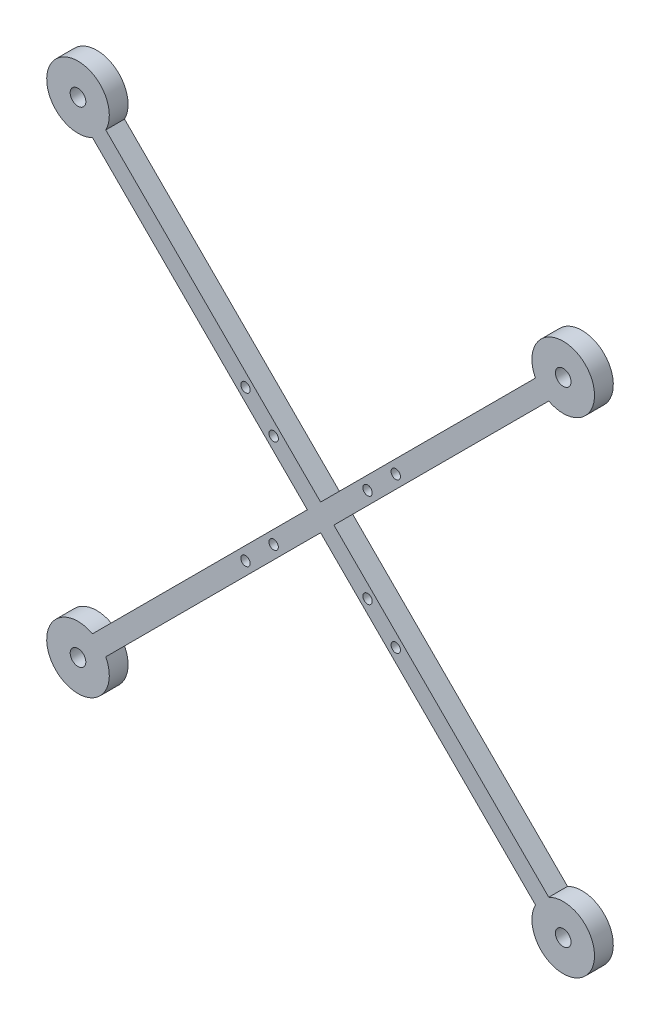
ISO-10303-21;
HEADER;
FILE_DESCRIPTION(('STEP AP214'),'2;1');
FILE_NAME('part.step','',(''),(''),'','','');
FILE_SCHEMA(('AUTOMOTIVE_DESIGN { 1 0 10303 214 1 1 1 1 }'));
ENDSEC;
DATA;
#1=APPLICATION_CONTEXT('core data for automotive mechanical design processes');
#2=APPLICATION_PROTOCOL_DEFINITION('international standard','automotive_design',2000,#1);
#3=PRODUCT_CONTEXT('',#1,'mechanical');
#4=PRODUCT('Part','Part','',(#3));
#5=PRODUCT_RELATED_PRODUCT_CATEGORY('part','',(#4));
#6=PRODUCT_DEFINITION_FORMATION('','',#4);
#7=PRODUCT_DEFINITION_CONTEXT('part definition',#1,'design');
#8=PRODUCT_DEFINITION('design','',#6,#7);
#9=PRODUCT_DEFINITION_SHAPE('','',#8);
#10=(LENGTH_UNIT() NAMED_UNIT(*) SI_UNIT(.MILLI.,.METRE.));
#11=(NAMED_UNIT(*) PLANE_ANGLE_UNIT() SI_UNIT($,.RADIAN.));
#12=(NAMED_UNIT(*) SI_UNIT($,.STERADIAN.) SOLID_ANGLE_UNIT());
#13=UNCERTAINTY_MEASURE_WITH_UNIT(LENGTH_MEASURE(1.E-05),#10,'distance_accuracy_value','');
#14=(GEOMETRIC_REPRESENTATION_CONTEXT(3) GLOBAL_UNCERTAINTY_ASSIGNED_CONTEXT((#13)) GLOBAL_UNIT_ASSIGNED_CONTEXT((#10,
#11,#12)) REPRESENTATION_CONTEXT('',''));
#15=CARTESIAN_POINT('',(0.,0.,0.));
#16=DIRECTION('',(0.,0.,1.));
#17=DIRECTION('',(1.,0.,0.));
#18=AXIS2_PLACEMENT_3D('',#15,#16,#17);
#19=CARTESIAN_POINT('',(-2.12132034355965,2.12132034355964,6.));
#20=DIRECTION('',(-0.707106781186548,0.707106781186547,0.));
#21=DIRECTION('',(-0.707106781186547,-0.707106781186548,0.));
#22=AXIS2_PLACEMENT_3D('',#19,#20,#21);
#23=PLANE('',#22);
#24=DIRECTION('',(0.707106781186547,0.707106781186548,0.));
#25=VECTOR('',#24,1.);
#26=CARTESIAN_POINT('',(-2.12132034355965,2.12132034355964,0.));
#27=LINE('',#26,#25);
#28=CARTESIAN_POINT('',(-72.8759515619436,-68.6333108748244,0.));
#29=VERTEX_POINT('',#28);
#30=CARTESIAN_POINT('',(-4.24264068711929,0.,0.));
#31=VERTEX_POINT('',#30);
#32=EDGE_CURVE('E199',#29,#31,#27,.T.);
#33=ORIENTED_EDGE('',*,*,#32,.F.);
#34=DIRECTION('',(0.,0.,-1.));
#35=VECTOR('',#34,1.);
#36=CARTESIAN_POINT('',(-72.8759515619436,-68.6333108748244,6.));
#37=LINE('',#36,#35);
#38=CARTESIAN_POINT('',(-72.8759515619436,-68.6333108748244,6.));
#39=VERTEX_POINT('',#38);
#40=EDGE_CURVE('E11',#39,#29,#37,.T.);
#41=ORIENTED_EDGE('',*,*,#40,.F.);
#42=DIRECTION('',(0.707106781186547,0.707106781186548,0.));
#43=VECTOR('',#42,1.);
#44=CARTESIAN_POINT('',(-2.12132034355965,2.12132034355964,6.));
#45=LINE('',#44,#43);
#46=CARTESIAN_POINT('',(-4.24264068711929,0.,6.));
#47=VERTEX_POINT('',#46);
#48=EDGE_CURVE('E590',#39,#47,#45,.T.);
#49=ORIENTED_EDGE('',*,*,#48,.T.);
#50=DIRECTION('',(0.,0.,-1.));
#51=VECTOR('',#50,1.);
#52=CARTESIAN_POINT('',(-4.24264068711929,0.,6.));
#53=LINE('',#52,#51);
#54=EDGE_CURVE('E105',#47,#31,#53,.T.);
#55=ORIENTED_EDGE('',*,*,#54,.T.);
#56=EDGE_LOOP('',(#33,#41,#49,#55));
#57=FACE_BOUND('',#56,.T.);
#58=ADVANCED_FACE('F41',(#57),#23,.T.);
#59=CARTESIAN_POINT('',(-77.5,-77.5,6.));
#60=DIRECTION('',(0.,0.,-1.));
#61=DIRECTION('',(-1.,0.,0.));
#62=AXIS2_PLACEMENT_3D('',#59,#60,#61);
#63=CYLINDRICAL_SURFACE('',#62,9.99999999999999);
#64=CARTESIAN_POINT('',(-77.5,-77.5,0.));
#65=DIRECTION('',(0.,0.,1.));
#66=DIRECTION('',(1.,0.,0.));
#67=AXIS2_PLACEMENT_3D('',#64,#65,#66);
#68=CIRCLE('',#67,9.99999999999999);
#69=CARTESIAN_POINT('',(-68.6333108748243,-72.8759515619436,0.));
#70=VERTEX_POINT('',#69);
#71=EDGE_CURVE('E201',#29,#70,#68,.T.);
#72=ORIENTED_EDGE('',*,*,#71,.T.);
#73=DIRECTION('',(0.,0.,-1.));
#74=VECTOR('',#73,1.);
#75=CARTESIAN_POINT('',(-68.6333108748243,-72.8759515619436,6.));
#76=LINE('',#75,#74);
#77=CARTESIAN_POINT('',(-68.6333108748243,-72.8759515619436,6.));
#78=VERTEX_POINT('',#77);
#79=EDGE_CURVE('E50',#78,#70,#76,.T.);
#80=ORIENTED_EDGE('',*,*,#79,.F.);
#81=CARTESIAN_POINT('',(-77.5,-77.5,6.));
#82=DIRECTION('',(0.,0.,1.));
#83=DIRECTION('',(1.,0.,0.));
#84=AXIS2_PLACEMENT_3D('',#81,#82,#83);
#85=CIRCLE('',#84,9.99999999999999);
#86=EDGE_CURVE('E576',#39,#78,#85,.T.);
#87=ORIENTED_EDGE('',*,*,#86,.F.);
#88=ORIENTED_EDGE('',*,*,#40,.T.);
#89=EDGE_LOOP('',(#72,#80,#87,#88));
#90=FACE_BOUND('',#89,.T.);
#91=ADVANCED_FACE('F255',(#90),#63,.T.);
#92=CARTESIAN_POINT('',(2.12132034355964,-2.12132034355964,6.));
#93=DIRECTION('',(-0.707106781186548,0.707106781186547,0.));
#94=DIRECTION('',(-0.707106781186547,-0.707106781186548,0.));
#95=AXIS2_PLACEMENT_3D('',#92,#93,#94);
#96=PLANE('',#95);
#97=DIRECTION('',(0.707106781186547,0.707106781186548,0.));
#98=VECTOR('',#97,1.);
#99=CARTESIAN_POINT('',(2.12132034355964,-2.12132034355964,0.));
#100=LINE('',#99,#98);
#101=CARTESIAN_POINT('',(0.,-4.24264068711927,0.));
#102=VERTEX_POINT('',#101);
#103=EDGE_CURVE('E204',#70,#102,#100,.T.);
#104=ORIENTED_EDGE('',*,*,#103,.T.);
#105=DIRECTION('',(0.,0.,-1.));
#106=VECTOR('',#105,1.);
#107=CARTESIAN_POINT('',(0.,-4.24264068711927,6.));
#108=LINE('',#107,#106);
#109=CARTESIAN_POINT('',(0.,-4.24264068711927,6.));
#110=VERTEX_POINT('',#109);
#111=EDGE_CURVE('E245',#110,#102,#108,.T.);
#112=ORIENTED_EDGE('',*,*,#111,.F.);
#113=DIRECTION('',(0.707106781186547,0.707106781186548,0.));
#114=VECTOR('',#113,1.);
#115=CARTESIAN_POINT('',(2.12132034355964,-2.12132034355964,6.));
#116=LINE('',#115,#114);
#117=EDGE_CURVE('E251',#78,#110,#116,.T.);
#118=ORIENTED_EDGE('',*,*,#117,.F.);
#119=ORIENTED_EDGE('',*,*,#79,.T.);
#120=EDGE_LOOP('',(#104,#112,#118,#119));
#121=FACE_BOUND('',#120,.T.);
#122=ADVANCED_FACE('F249',(#121),#96,.F.);
#123=CARTESIAN_POINT('',(-2.12132034355963,-2.12132034355963,6.));
#124=DIRECTION('',(-0.707106781186547,-0.707106781186547,0.));
#125=DIRECTION('',(0.707106781186548,-0.707106781186548,0.));
#126=AXIS2_PLACEMENT_3D('',#123,#124,#125);
#127=PLANE('',#126);
#128=DIRECTION('',(-0.707106781186548,0.707106781186548,0.));
#129=VECTOR('',#128,1.);
#130=CARTESIAN_POINT('',(-2.12132034355963,-2.12132034355963,0.));
#131=LINE('',#130,#129);
#132=CARTESIAN_POINT('',(68.6333108748243,-72.8759515619436,0.));
#133=VERTEX_POINT('',#132);
#134=EDGE_CURVE('E207',#133,#102,#131,.T.);
#135=ORIENTED_EDGE('',*,*,#134,.F.);
#136=DIRECTION('',(0.,0.,-1.));
#137=VECTOR('',#136,1.);
#138=CARTESIAN_POINT('',(68.6333108748243,-72.8759515619436,6.));
#139=LINE('',#138,#137);
#140=CARTESIAN_POINT('',(68.6333108748243,-72.8759515619436,6.));
#141=VERTEX_POINT('',#140);
#142=EDGE_CURVE('E243',#141,#133,#139,.T.);
#143=ORIENTED_EDGE('',*,*,#142,.F.);
#144=DIRECTION('',(-0.707106781186548,0.707106781186548,0.));
#145=VECTOR('',#144,1.);
#146=CARTESIAN_POINT('',(-2.12132034355963,-2.12132034355963,6.));
#147=LINE('',#146,#145);
#148=EDGE_CURVE('E573',#141,#110,#147,.T.);
#149=ORIENTED_EDGE('',*,*,#148,.T.);
#150=ORIENTED_EDGE('',*,*,#111,.T.);
#151=EDGE_LOOP('',(#135,#143,#149,#150));
#152=FACE_BOUND('',#151,.T.);
#153=ADVANCED_FACE('F383',(#152),#127,.T.);
#154=CARTESIAN_POINT('',(77.5,-77.5,6.));
#155=DIRECTION('',(0.,0.,-1.));
#156=DIRECTION('',(-1.,0.,0.));
#157=AXIS2_PLACEMENT_3D('',#154,#155,#156);
#158=CYLINDRICAL_SURFACE('',#157,9.99999999999999);
#159=CARTESIAN_POINT('',(77.5,-77.5,0.));
#160=DIRECTION('',(0.,0.,1.));
#161=DIRECTION('',(1.,0.,0.));
#162=AXIS2_PLACEMENT_3D('',#159,#160,#161);
#163=CIRCLE('',#162,9.99999999999999);
#164=CARTESIAN_POINT('',(72.8759515619437,-68.6333108748243,0.));
#165=VERTEX_POINT('',#164);
#166=EDGE_CURVE('E210',#133,#165,#163,.T.);
#167=ORIENTED_EDGE('',*,*,#166,.T.);
#168=DIRECTION('',(0.,0.,-1.));
#169=VECTOR('',#168,1.);
#170=CARTESIAN_POINT('',(72.8759515619437,-68.6333108748243,6.));
#171=LINE('',#170,#169);
#172=CARTESIAN_POINT('',(72.8759515619437,-68.6333108748243,6.));
#173=VERTEX_POINT('',#172);
#174=EDGE_CURVE('E240',#173,#165,#171,.T.);
#175=ORIENTED_EDGE('',*,*,#174,.F.);
#176=CARTESIAN_POINT('',(77.5,-77.5,6.));
#177=DIRECTION('',(0.,0.,1.));
#178=DIRECTION('',(1.,0.,0.));
#179=AXIS2_PLACEMENT_3D('',#176,#177,#178);
#180=CIRCLE('',#179,9.99999999999999);
#181=EDGE_CURVE('E570',#141,#173,#180,.T.);
#182=ORIENTED_EDGE('',*,*,#181,.F.);
#183=ORIENTED_EDGE('',*,*,#142,.T.);
#184=EDGE_LOOP('',(#167,#175,#182,#183));
#185=FACE_BOUND('',#184,.T.);
#186=ADVANCED_FACE('F379',(#185),#158,.T.);
#187=CARTESIAN_POINT('',(2.12132034355965,2.12132034355965,6.));
#188=DIRECTION('',(-0.707106781186547,-0.707106781186548,0.));
#189=DIRECTION('',(0.707106781186548,-0.707106781186547,0.));
#190=AXIS2_PLACEMENT_3D('',#187,#188,#189);
#191=PLANE('',#190);
#192=DIRECTION('',(-0.707106781186548,0.707106781186547,0.));
#193=VECTOR('',#192,1.);
#194=CARTESIAN_POINT('',(2.12132034355965,2.12132034355965,0.));
#195=LINE('',#194,#193);
#196=CARTESIAN_POINT('',(4.2426406871193,0.,0.));
#197=VERTEX_POINT('',#196);
#198=EDGE_CURVE('E213',#165,#197,#195,.T.);
#199=ORIENTED_EDGE('',*,*,#198,.T.);
#200=DIRECTION('',(0.,0.,-1.));
#201=VECTOR('',#200,1.);
#202=CARTESIAN_POINT('',(4.2426406871193,0.,6.));
#203=LINE('',#202,#201);
#204=CARTESIAN_POINT('',(4.2426406871193,0.,6.));
#205=VERTEX_POINT('',#204);
#206=EDGE_CURVE('E238',#205,#197,#203,.T.);
#207=ORIENTED_EDGE('',*,*,#206,.F.);
#208=DIRECTION('',(-0.707106781186548,0.707106781186547,0.));
#209=VECTOR('',#208,1.);
#210=CARTESIAN_POINT('',(2.12132034355965,2.12132034355965,6.));
#211=LINE('',#210,#209);
#212=EDGE_CURVE('E572',#173,#205,#211,.T.);
#213=ORIENTED_EDGE('',*,*,#212,.F.);
#214=ORIENTED_EDGE('',*,*,#174,.T.);
#215=EDGE_LOOP('',(#199,#207,#213,#214));
#216=FACE_BOUND('',#215,.T.);
#217=ADVANCED_FACE('F375',(#216),#191,.F.);
#218=CARTESIAN_POINT('',(2.12132034355964,-2.12132034355964,6.));
#219=DIRECTION('',(0.707106781186547,-0.707106781186548,0.));
#220=DIRECTION('',(0.707106781186548,0.707106781186547,0.));
#221=AXIS2_PLACEMENT_3D('',#218,#219,#220);
#222=PLANE('',#221);
#223=DIRECTION('',(-0.707106781186548,-0.707106781186547,0.));
#224=VECTOR('',#223,1.);
#225=CARTESIAN_POINT('',(2.12132034355964,-2.12132034355964,0.));
#226=LINE('',#225,#224);
#227=CARTESIAN_POINT('',(72.8759515619436,68.6333108748243,0.));
#228=VERTEX_POINT('',#227);
#229=EDGE_CURVE('E216',#228,#197,#226,.T.);
#230=ORIENTED_EDGE('',*,*,#229,.F.);
#231=DIRECTION('',(0.,0.,-1.));
#232=VECTOR('',#231,1.);
#233=CARTESIAN_POINT('',(72.8759515619436,68.6333108748243,6.));
#234=LINE('',#233,#232);
#235=CARTESIAN_POINT('',(72.8759515619436,68.6333108748243,6.));
#236=VERTEX_POINT('',#235);
#237=EDGE_CURVE('E236',#236,#228,#234,.T.);
#238=ORIENTED_EDGE('',*,*,#237,.F.);
#239=DIRECTION('',(-0.707106781186548,-0.707106781186547,0.));
#240=VECTOR('',#239,1.);
#241=CARTESIAN_POINT('',(2.12132034355964,-2.12132034355964,6.));
#242=LINE('',#241,#240);
#243=EDGE_CURVE('E581',#236,#205,#242,.T.);
#244=ORIENTED_EDGE('',*,*,#243,.T.);
#245=ORIENTED_EDGE('',*,*,#206,.T.);
#246=EDGE_LOOP('',(#230,#238,#244,#245));
#247=FACE_BOUND('',#246,.T.);
#248=ADVANCED_FACE('F371',(#247),#222,.T.);
#249=CARTESIAN_POINT('',(77.5,77.5,6.));
#250=DIRECTION('',(0.,0.,-1.));
#251=DIRECTION('',(-1.,0.,0.));
#252=AXIS2_PLACEMENT_3D('',#249,#250,#251);
#253=CYLINDRICAL_SURFACE('',#252,9.99999999999999);
#254=CARTESIAN_POINT('',(77.5,77.5,0.));
#255=DIRECTION('',(0.,0.,1.));
#256=DIRECTION('',(1.,0.,0.));
#257=AXIS2_PLACEMENT_3D('',#254,#255,#256);
#258=CIRCLE('',#257,9.99999999999999);
#259=CARTESIAN_POINT('',(68.6333108748243,72.8759515619436,0.));
#260=VERTEX_POINT('',#259);
#261=EDGE_CURVE('E219',#228,#260,#258,.T.);
#262=ORIENTED_EDGE('',*,*,#261,.T.);
#263=DIRECTION('',(0.,0.,-1.));
#264=VECTOR('',#263,1.);
#265=CARTESIAN_POINT('',(68.6333108748243,72.8759515619436,6.));
#266=LINE('',#265,#264);
#267=CARTESIAN_POINT('',(68.6333108748243,72.8759515619436,6.));
#268=VERTEX_POINT('',#267);
#269=EDGE_CURVE('E233',#268,#260,#266,.T.);
#270=ORIENTED_EDGE('',*,*,#269,.F.);
#271=CARTESIAN_POINT('',(77.5,77.5,6.));
#272=DIRECTION('',(0.,0.,1.));
#273=DIRECTION('',(1.,0.,0.));
#274=AXIS2_PLACEMENT_3D('',#271,#272,#273);
#275=CIRCLE('',#274,9.99999999999999);
#276=EDGE_CURVE('E158',#236,#268,#275,.T.);
#277=ORIENTED_EDGE('',*,*,#276,.F.);
#278=ORIENTED_EDGE('',*,*,#237,.T.);
#279=EDGE_LOOP('',(#262,#270,#277,#278));
#280=FACE_BOUND('',#279,.T.);
#281=ADVANCED_FACE('F367',(#280),#253,.T.);
#282=CARTESIAN_POINT('',(-2.12132034355965,2.12132034355965,6.));
#283=DIRECTION('',(0.707106781186547,-0.707106781186547,0.));
#284=DIRECTION('',(0.707106781186548,0.707106781186548,0.));
#285=AXIS2_PLACEMENT_3D('',#282,#283,#284);
#286=PLANE('',#285);
#287=DIRECTION('',(-0.707106781186548,-0.707106781186548,0.));
#288=VECTOR('',#287,1.);
#289=CARTESIAN_POINT('',(-2.12132034355965,2.12132034355965,0.));
#290=LINE('',#289,#288);
#291=CARTESIAN_POINT('',(0.,4.24264068711929,0.));
#292=VERTEX_POINT('',#291);
#293=EDGE_CURVE('E222',#260,#292,#290,.T.);
#294=ORIENTED_EDGE('',*,*,#293,.T.);
#295=DIRECTION('',(0.,0.,-1.));
#296=VECTOR('',#295,1.);
#297=CARTESIAN_POINT('',(0.,4.24264068711929,6.));
#298=LINE('',#297,#296);
#299=CARTESIAN_POINT('',(0.,4.24264068711929,6.));
#300=VERTEX_POINT('',#299);
#301=EDGE_CURVE('E146',#300,#292,#298,.T.);
#302=ORIENTED_EDGE('',*,*,#301,.F.);
#303=DIRECTION('',(-0.707106781186548,-0.707106781186548,0.));
#304=VECTOR('',#303,1.);
#305=CARTESIAN_POINT('',(-2.12132034355965,2.12132034355965,6.));
#306=LINE('',#305,#304);
#307=EDGE_CURVE('E155',#268,#300,#306,.T.);
#308=ORIENTED_EDGE('',*,*,#307,.F.);
#309=ORIENTED_EDGE('',*,*,#269,.T.);
#310=EDGE_LOOP('',(#294,#302,#308,#309));
#311=FACE_BOUND('',#310,.T.);
#312=ADVANCED_FACE('F364',(#311),#286,.F.);
#313=CARTESIAN_POINT('',(2.12132034355963,2.12132034355962,6.));
#314=DIRECTION('',(0.707106781186548,0.707106781186547,0.));
#315=DIRECTION('',(-0.707106781186547,0.707106781186548,0.));
#316=AXIS2_PLACEMENT_3D('',#313,#314,#315);
#317=PLANE('',#316);
#318=DIRECTION('',(0.707106781186547,-0.707106781186548,0.));
#319=VECTOR('',#318,1.);
#320=CARTESIAN_POINT('',(2.12132034355963,2.12132034355962,0.));
#321=LINE('',#320,#319);
#322=CARTESIAN_POINT('',(-68.6333108748243,72.8759515619437,0.));
#323=VERTEX_POINT('',#322);
#324=EDGE_CURVE('E143',#323,#292,#321,.T.);
#325=ORIENTED_EDGE('',*,*,#324,.F.);
#326=DIRECTION('',(0.,0.,-1.));
#327=VECTOR('',#326,1.);
#328=CARTESIAN_POINT('',(-68.6333108748243,72.8759515619437,6.));
#329=LINE('',#328,#327);
#330=CARTESIAN_POINT('',(-68.6333108748243,72.8759515619437,6.));
#331=VERTEX_POINT('',#330);
#332=EDGE_CURVE('E137',#331,#323,#329,.T.);
#333=ORIENTED_EDGE('',*,*,#332,.F.);
#334=DIRECTION('',(0.707106781186547,-0.707106781186548,0.));
#335=VECTOR('',#334,1.);
#336=CARTESIAN_POINT('',(2.12132034355963,2.12132034355962,6.));
#337=LINE('',#336,#335);
#338=EDGE_CURVE('E141',#331,#300,#337,.T.);
#339=ORIENTED_EDGE('',*,*,#338,.T.);
#340=ORIENTED_EDGE('',*,*,#301,.T.);
#341=EDGE_LOOP('',(#325,#333,#339,#340));
#342=FACE_BOUND('',#341,.T.);
#343=ADVANCED_FACE('F139',(#342),#317,.T.);
#344=CARTESIAN_POINT('',(-77.5,77.5,6.));
#345=DIRECTION('',(0.,0.,-1.));
#346=DIRECTION('',(-1.,0.,0.));
#347=AXIS2_PLACEMENT_3D('',#344,#345,#346);
#348=CYLINDRICAL_SURFACE('',#347,9.99999999999999);
#349=CARTESIAN_POINT('',(-77.5,77.5,0.));
#350=DIRECTION('',(0.,0.,1.));
#351=DIRECTION('',(1.,0.,0.));
#352=AXIS2_PLACEMENT_3D('',#349,#350,#351);
#353=CIRCLE('',#352,9.99999999999999);
#354=CARTESIAN_POINT('',(-72.8759515619436,68.6333108748243,0.));
#355=VERTEX_POINT('',#354);
#356=EDGE_CURVE('E226',#323,#355,#353,.T.);
#357=ORIENTED_EDGE('',*,*,#356,.T.);
#358=DIRECTION('',(0.,0.,-1.));
#359=VECTOR('',#358,1.);
#360=CARTESIAN_POINT('',(-72.8759515619436,68.6333108748243,6.));
#361=LINE('',#360,#359);
#362=CARTESIAN_POINT('',(-72.8759515619436,68.6333108748243,6.));
#363=VERTEX_POINT('',#362);
#364=EDGE_CURVE('E147',#363,#355,#361,.T.);
#365=ORIENTED_EDGE('',*,*,#364,.F.);
#366=CARTESIAN_POINT('',(-77.5,77.5,6.));
#367=DIRECTION('',(0.,0.,1.));
#368=DIRECTION('',(1.,0.,0.));
#369=AXIS2_PLACEMENT_3D('',#366,#367,#368);
#370=CIRCLE('',#369,9.99999999999999);
#371=EDGE_CURVE('E150',#331,#363,#370,.T.);
#372=ORIENTED_EDGE('',*,*,#371,.F.);
#373=ORIENTED_EDGE('',*,*,#332,.T.);
#374=EDGE_LOOP('',(#357,#365,#372,#373));
#375=FACE_BOUND('',#374,.T.);
#376=ADVANCED_FACE('F151',(#375),#348,.T.);
#377=CARTESIAN_POINT('',(77.5,-77.5,6.));
#378=DIRECTION('',(0.,0.,-1.));
#379=DIRECTION('',(-1.,0.,0.));
#380=AXIS2_PLACEMENT_3D('',#377,#378,#379);
#381=CYLINDRICAL_SURFACE('',#380,2.5);
#382=CARTESIAN_POINT('',(77.5,-77.5,6.));
#383=DIRECTION('',(0.,0.,1.));
#384=DIRECTION('',(1.,0.,0.));
#385=AXIS2_PLACEMENT_3D('',#382,#383,#384);
#386=CIRCLE('',#385,2.5);
#387=CARTESIAN_POINT('',(80.,-77.5,6.));
#388=VERTEX_POINT('',#387);
#389=EDGE_CURVE('E592',#388,#388,#386,.T.);
#390=ORIENTED_EDGE('',*,*,#389,.T.);
#391=EDGE_LOOP('',(#390));
#392=FACE_BOUND('',#391,.T.);
#393=CARTESIAN_POINT('',(77.5,-77.5,0.));
#394=DIRECTION('',(0.,0.,1.));
#395=DIRECTION('',(1.,0.,0.));
#396=AXIS2_PLACEMENT_3D('',#393,#394,#395);
#397=CIRCLE('',#396,2.5);
#398=CARTESIAN_POINT('',(80.,-77.5,0.));
#399=VERTEX_POINT('',#398);
#400=EDGE_CURVE('E196',#399,#399,#397,.T.);
#401=ORIENTED_EDGE('',*,*,#400,.F.);
#402=EDGE_LOOP('',(#401));
#403=FACE_BOUND('',#402,.T.);
#404=ADVANCED_FACE('F265',(#392,#403),#381,.F.);
#405=CARTESIAN_POINT('',(15.,-15.,6.));
#406=DIRECTION('',(0.,0.,-1.));
#407=DIRECTION('',(-1.,0.,0.));
#408=AXIS2_PLACEMENT_3D('',#405,#406,#407);
#409=CYLINDRICAL_SURFACE('',#408,1.5);
#410=CARTESIAN_POINT('',(15.,-15.,6.));
#411=DIRECTION('',(0.,0.,1.));
#412=DIRECTION('',(1.,0.,0.));
#413=AXIS2_PLACEMENT_3D('',#410,#411,#412);
#414=CIRCLE('',#413,1.5);
#415=CARTESIAN_POINT('',(16.5,-15.,6.));
#416=VERTEX_POINT('',#415);
#417=EDGE_CURVE('E595',#416,#416,#414,.T.);
#418=ORIENTED_EDGE('',*,*,#417,.T.);
#419=EDGE_LOOP('',(#418));
#420=FACE_BOUND('',#419,.T.);
#421=CARTESIAN_POINT('',(15.,-15.,0.));
#422=DIRECTION('',(0.,0.,1.));
#423=DIRECTION('',(1.,0.,0.));
#424=AXIS2_PLACEMENT_3D('',#421,#422,#423);
#425=CIRCLE('',#424,1.5);
#426=CARTESIAN_POINT('',(16.5,-15.,0.));
#427=VERTEX_POINT('',#426);
#428=EDGE_CURVE('E193',#427,#427,#425,.T.);
#429=ORIENTED_EDGE('',*,*,#428,.F.);
#430=EDGE_LOOP('',(#429));
#431=FACE_BOUND('',#430,.T.);
#432=ADVANCED_FACE('F268',(#420,#431),#409,.F.);
#433=CARTESIAN_POINT('',(24.,-24.,6.));
#434=DIRECTION('',(0.,0.,-1.));
#435=DIRECTION('',(-1.,0.,0.));
#436=AXIS2_PLACEMENT_3D('',#433,#434,#435);
#437=CYLINDRICAL_SURFACE('',#436,1.5);
#438=CARTESIAN_POINT('',(24.,-24.,6.));
#439=DIRECTION('',(0.,0.,1.));
#440=DIRECTION('',(1.,0.,0.));
#441=AXIS2_PLACEMENT_3D('',#438,#439,#440);
#442=CIRCLE('',#441,1.5);
#443=CARTESIAN_POINT('',(25.5,-24.,6.));
#444=VERTEX_POINT('',#443);
#445=EDGE_CURVE('E598',#444,#444,#442,.T.);
#446=ORIENTED_EDGE('',*,*,#445,.T.);
#447=EDGE_LOOP('',(#446));
#448=FACE_BOUND('',#447,.T.);
#449=CARTESIAN_POINT('',(24.,-24.,0.));
#450=DIRECTION('',(0.,0.,1.));
#451=DIRECTION('',(1.,0.,0.));
#452=AXIS2_PLACEMENT_3D('',#449,#450,#451);
#453=CIRCLE('',#452,1.5);
#454=CARTESIAN_POINT('',(25.5,-24.,0.));
#455=VERTEX_POINT('',#454);
#456=EDGE_CURVE('E190',#455,#455,#453,.T.);
#457=ORIENTED_EDGE('',*,*,#456,.F.);
#458=EDGE_LOOP('',(#457));
#459=FACE_BOUND('',#458,.T.);
#460=ADVANCED_FACE('F272',(#448,#459),#437,.F.);
#461=CARTESIAN_POINT('',(77.5,77.5,6.));
#462=DIRECTION('',(0.,0.,-1.));
#463=DIRECTION('',(-1.,0.,0.));
#464=AXIS2_PLACEMENT_3D('',#461,#462,#463);
#465=CYLINDRICAL_SURFACE('',#464,2.50000000000001);
#466=CARTESIAN_POINT('',(77.5,77.5,6.));
#467=DIRECTION('',(0.,0.,1.));
#468=DIRECTION('',(1.,0.,0.));
#469=AXIS2_PLACEMENT_3D('',#466,#467,#468);
#470=CIRCLE('',#469,2.50000000000001);
#471=CARTESIAN_POINT('',(80.,77.5,6.));
#472=VERTEX_POINT('',#471);
#473=EDGE_CURVE('E601',#472,#472,#470,.T.);
#474=ORIENTED_EDGE('',*,*,#473,.T.);
#475=EDGE_LOOP('',(#474));
#476=FACE_BOUND('',#475,.T.);
#477=CARTESIAN_POINT('',(77.5,77.5,0.));
#478=DIRECTION('',(0.,0.,1.));
#479=DIRECTION('',(1.,0.,0.));
#480=AXIS2_PLACEMENT_3D('',#477,#478,#479);
#481=CIRCLE('',#480,2.50000000000001);
#482=CARTESIAN_POINT('',(80.,77.5,0.));
#483=VERTEX_POINT('',#482);
#484=EDGE_CURVE('E187',#483,#483,#481,.T.);
#485=ORIENTED_EDGE('',*,*,#484,.F.);
#486=EDGE_LOOP('',(#485));
#487=FACE_BOUND('',#486,.T.);
#488=ADVANCED_FACE('F276',(#476,#487),#465,.F.);
#489=CARTESIAN_POINT('',(15.,15.,6.));
#490=DIRECTION('',(0.,0.,-1.));
#491=DIRECTION('',(-1.,0.,0.));
#492=AXIS2_PLACEMENT_3D('',#489,#490,#491);
#493=CYLINDRICAL_SURFACE('',#492,1.5);
#494=CARTESIAN_POINT('',(15.,15.,6.));
#495=DIRECTION('',(0.,0.,1.));
#496=DIRECTION('',(1.,0.,0.));
#497=AXIS2_PLACEMENT_3D('',#494,#495,#496);
#498=CIRCLE('',#497,1.5);
#499=CARTESIAN_POINT('',(16.5,15.,6.));
#500=VERTEX_POINT('',#499);
#501=EDGE_CURVE('E604',#500,#500,#498,.T.);
#502=ORIENTED_EDGE('',*,*,#501,.T.);
#503=EDGE_LOOP('',(#502));
#504=FACE_BOUND('',#503,.T.);
#505=CARTESIAN_POINT('',(15.,15.,0.));
#506=DIRECTION('',(0.,0.,1.));
#507=DIRECTION('',(1.,0.,0.));
#508=AXIS2_PLACEMENT_3D('',#505,#506,#507);
#509=CIRCLE('',#508,1.5);
#510=CARTESIAN_POINT('',(16.5,15.,0.));
#511=VERTEX_POINT('',#510);
#512=EDGE_CURVE('E184',#511,#511,#509,.T.);
#513=ORIENTED_EDGE('',*,*,#512,.F.);
#514=EDGE_LOOP('',(#513));
#515=FACE_BOUND('',#514,.T.);
#516=ADVANCED_FACE('F280',(#504,#515),#493,.F.);
#517=CARTESIAN_POINT('',(24.,24.,6.));
#518=DIRECTION('',(0.,0.,-1.));
#519=DIRECTION('',(-1.,0.,0.));
#520=AXIS2_PLACEMENT_3D('',#517,#518,#519);
#521=CYLINDRICAL_SURFACE('',#520,1.5);
#522=CARTESIAN_POINT('',(24.,24.,6.));
#523=DIRECTION('',(0.,0.,1.));
#524=DIRECTION('',(1.,0.,0.));
#525=AXIS2_PLACEMENT_3D('',#522,#523,#524);
#526=CIRCLE('',#525,1.5);
#527=CARTESIAN_POINT('',(25.5,24.,6.));
#528=VERTEX_POINT('',#527);
#529=EDGE_CURVE('E607',#528,#528,#526,.T.);
#530=ORIENTED_EDGE('',*,*,#529,.T.);
#531=EDGE_LOOP('',(#530));
#532=FACE_BOUND('',#531,.T.);
#533=CARTESIAN_POINT('',(24.,24.,0.));
#534=DIRECTION('',(0.,0.,1.));
#535=DIRECTION('',(1.,0.,0.));
#536=AXIS2_PLACEMENT_3D('',#533,#534,#535);
#537=CIRCLE('',#536,1.5);
#538=CARTESIAN_POINT('',(25.5,24.,0.));
#539=VERTEX_POINT('',#538);
#540=EDGE_CURVE('E181',#539,#539,#537,.T.);
#541=ORIENTED_EDGE('',*,*,#540,.F.);
#542=EDGE_LOOP('',(#541));
#543=FACE_BOUND('',#542,.T.);
#544=ADVANCED_FACE('F284',(#532,#543),#521,.F.);
#545=CARTESIAN_POINT('',(-77.5,77.5,6.));
#546=DIRECTION('',(0.,0.,-1.));
#547=DIRECTION('',(-1.,0.,0.));
#548=AXIS2_PLACEMENT_3D('',#545,#546,#547);
#549=CYLINDRICAL_SURFACE('',#548,2.50000000000001);
#550=CARTESIAN_POINT('',(-77.5,77.5,6.));
#551=DIRECTION('',(0.,0.,1.));
#552=DIRECTION('',(1.,0.,0.));
#553=AXIS2_PLACEMENT_3D('',#550,#551,#552);
#554=CIRCLE('',#553,2.50000000000001);
#555=CARTESIAN_POINT('',(-75.,77.5,6.));
#556=VERTEX_POINT('',#555);
#557=EDGE_CURVE('E610',#556,#556,#554,.T.);
#558=ORIENTED_EDGE('',*,*,#557,.T.);
#559=EDGE_LOOP('',(#558));
#560=FACE_BOUND('',#559,.T.);
#561=CARTESIAN_POINT('',(-77.5,77.5,0.));
#562=DIRECTION('',(0.,0.,1.));
#563=DIRECTION('',(1.,0.,0.));
#564=AXIS2_PLACEMENT_3D('',#561,#562,#563);
#565=CIRCLE('',#564,2.50000000000001);
#566=CARTESIAN_POINT('',(-75.,77.5,0.));
#567=VERTEX_POINT('',#566);
#568=EDGE_CURVE('E178',#567,#567,#565,.T.);
#569=ORIENTED_EDGE('',*,*,#568,.F.);
#570=EDGE_LOOP('',(#569));
#571=FACE_BOUND('',#570,.T.);
#572=ADVANCED_FACE('F288',(#560,#571),#549,.F.);
#573=CARTESIAN_POINT('',(-15.,15.,6.));
#574=DIRECTION('',(0.,0.,-1.));
#575=DIRECTION('',(-1.,0.,0.));
#576=AXIS2_PLACEMENT_3D('',#573,#574,#575);
#577=CYLINDRICAL_SURFACE('',#576,1.5);
#578=CARTESIAN_POINT('',(-15.,15.,6.));
#579=DIRECTION('',(0.,0.,1.));
#580=DIRECTION('',(1.,0.,0.));
#581=AXIS2_PLACEMENT_3D('',#578,#579,#580);
#582=CIRCLE('',#581,1.5);
#583=CARTESIAN_POINT('',(-13.5,15.,6.));
#584=VERTEX_POINT('',#583);
#585=EDGE_CURVE('E613',#584,#584,#582,.T.);
#586=ORIENTED_EDGE('',*,*,#585,.T.);
#587=EDGE_LOOP('',(#586));
#588=FACE_BOUND('',#587,.T.);
#589=CARTESIAN_POINT('',(-15.,15.,0.));
#590=DIRECTION('',(0.,0.,1.));
#591=DIRECTION('',(1.,0.,0.));
#592=AXIS2_PLACEMENT_3D('',#589,#590,#591);
#593=CIRCLE('',#592,1.5);
#594=CARTESIAN_POINT('',(-13.5,15.,0.));
#595=VERTEX_POINT('',#594);
#596=EDGE_CURVE('E175',#595,#595,#593,.T.);
#597=ORIENTED_EDGE('',*,*,#596,.F.);
#598=EDGE_LOOP('',(#597));
#599=FACE_BOUND('',#598,.T.);
#600=ADVANCED_FACE('F292',(#588,#599),#577,.F.);
#601=CARTESIAN_POINT('',(-24.,24.,6.));
#602=DIRECTION('',(0.,0.,-1.));
#603=DIRECTION('',(-1.,0.,0.));
#604=AXIS2_PLACEMENT_3D('',#601,#602,#603);
#605=CYLINDRICAL_SURFACE('',#604,1.5);
#606=CARTESIAN_POINT('',(-24.,24.,6.));
#607=DIRECTION('',(0.,0.,1.));
#608=DIRECTION('',(1.,0.,0.));
#609=AXIS2_PLACEMENT_3D('',#606,#607,#608);
#610=CIRCLE('',#609,1.5);
#611=CARTESIAN_POINT('',(-22.5,24.,6.));
#612=VERTEX_POINT('',#611);
#613=EDGE_CURVE('E616',#612,#612,#610,.T.);
#614=ORIENTED_EDGE('',*,*,#613,.T.);
#615=EDGE_LOOP('',(#614));
#616=FACE_BOUND('',#615,.T.);
#617=CARTESIAN_POINT('',(-24.,24.,0.));
#618=DIRECTION('',(0.,0.,1.));
#619=DIRECTION('',(1.,0.,0.));
#620=AXIS2_PLACEMENT_3D('',#617,#618,#619);
#621=CIRCLE('',#620,1.5);
#622=CARTESIAN_POINT('',(-22.5,24.,0.));
#623=VERTEX_POINT('',#622);
#624=EDGE_CURVE('E172',#623,#623,#621,.T.);
#625=ORIENTED_EDGE('',*,*,#624,.F.);
#626=EDGE_LOOP('',(#625));
#627=FACE_BOUND('',#626,.T.);
#628=ADVANCED_FACE('F296',(#616,#627),#605,.F.);
#629=CARTESIAN_POINT('',(-24.,-24.,6.));
#630=DIRECTION('',(0.,0.,-1.));
#631=DIRECTION('',(-1.,0.,0.));
#632=AXIS2_PLACEMENT_3D('',#629,#630,#631);
#633=CYLINDRICAL_SURFACE('',#632,1.5);
#634=CARTESIAN_POINT('',(-24.,-24.,6.));
#635=DIRECTION('',(0.,0.,1.));
#636=DIRECTION('',(1.,0.,0.));
#637=AXIS2_PLACEMENT_3D('',#634,#635,#636);
#638=CIRCLE('',#637,1.5);
#639=CARTESIAN_POINT('',(-22.5,-24.,6.));
#640=VERTEX_POINT('',#639);
#641=EDGE_CURVE('E619',#640,#640,#638,.T.);
#642=ORIENTED_EDGE('',*,*,#641,.T.);
#643=EDGE_LOOP('',(#642));
#644=FACE_BOUND('',#643,.T.);
#645=CARTESIAN_POINT('',(-24.,-24.,0.));
#646=DIRECTION('',(0.,0.,1.));
#647=DIRECTION('',(1.,0.,0.));
#648=AXIS2_PLACEMENT_3D('',#645,#646,#647);
#649=CIRCLE('',#648,1.5);
#650=CARTESIAN_POINT('',(-22.5,-24.,0.));
#651=VERTEX_POINT('',#650);
#652=EDGE_CURVE('E169',#651,#651,#649,.T.);
#653=ORIENTED_EDGE('',*,*,#652,.F.);
#654=EDGE_LOOP('',(#653));
#655=FACE_BOUND('',#654,.T.);
#656=ADVANCED_FACE('F300',(#644,#655),#633,.F.);
#657=CARTESIAN_POINT('',(-15.,-15.,6.));
#658=DIRECTION('',(0.,0.,-1.));
#659=DIRECTION('',(-1.,0.,0.));
#660=AXIS2_PLACEMENT_3D('',#657,#658,#659);
#661=CYLINDRICAL_SURFACE('',#660,1.5);
#662=CARTESIAN_POINT('',(-15.,-15.,6.));
#663=DIRECTION('',(0.,0.,1.));
#664=DIRECTION('',(1.,0.,0.));
#665=AXIS2_PLACEMENT_3D('',#662,#663,#664);
#666=CIRCLE('',#665,1.5);
#667=CARTESIAN_POINT('',(-13.5,-15.,6.));
#668=VERTEX_POINT('',#667);
#669=EDGE_CURVE('E315',#668,#668,#666,.T.);
#670=ORIENTED_EDGE('',*,*,#669,.T.);
#671=EDGE_LOOP('',(#670));
#672=FACE_BOUND('',#671,.T.);
#673=CARTESIAN_POINT('',(-15.,-15.,0.));
#674=DIRECTION('',(0.,0.,1.));
#675=DIRECTION('',(1.,0.,0.));
#676=AXIS2_PLACEMENT_3D('',#673,#674,#675);
#677=CIRCLE('',#676,1.5);
#678=CARTESIAN_POINT('',(-13.5,-15.,0.));
#679=VERTEX_POINT('',#678);
#680=EDGE_CURVE('E166',#679,#679,#677,.T.);
#681=ORIENTED_EDGE('',*,*,#680,.F.);
#682=EDGE_LOOP('',(#681));
#683=FACE_BOUND('',#682,.T.);
#684=ADVANCED_FACE('F303',(#672,#683),#661,.F.);
#685=CARTESIAN_POINT('',(-77.5,-77.5,6.));
#686=DIRECTION('',(0.,0.,-1.));
#687=DIRECTION('',(-1.,0.,0.));
#688=AXIS2_PLACEMENT_3D('',#685,#686,#687);
#689=CYLINDRICAL_SURFACE('',#688,2.5);
#690=CARTESIAN_POINT('',(-77.5,-77.5,6.));
#691=DIRECTION('',(0.,0.,1.));
#692=DIRECTION('',(1.,0.,0.));
#693=AXIS2_PLACEMENT_3D('',#690,#691,#692);
#694=CIRCLE('',#693,2.5);
#695=CARTESIAN_POINT('',(-75.,-77.5,6.));
#696=VERTEX_POINT('',#695);
#697=EDGE_CURVE('E229',#696,#696,#694,.T.);
#698=ORIENTED_EDGE('',*,*,#697,.T.);
#699=EDGE_LOOP('',(#698));
#700=FACE_BOUND('',#699,.T.);
#701=CARTESIAN_POINT('',(-77.5,-77.5,0.));
#702=DIRECTION('',(0.,0.,1.));
#703=DIRECTION('',(1.,0.,0.));
#704=AXIS2_PLACEMENT_3D('',#701,#702,#703);
#705=CIRCLE('',#704,2.5);
#706=CARTESIAN_POINT('',(-75.,-77.5,0.));
#707=VERTEX_POINT('',#706);
#708=EDGE_CURVE('E163',#707,#707,#705,.T.);
#709=ORIENTED_EDGE('',*,*,#708,.F.);
#710=EDGE_LOOP('',(#709));
#711=FACE_BOUND('',#710,.T.);
#712=ADVANCED_FACE('F43',(#700,#711),#689,.F.);
#713=CARTESIAN_POINT('',(-2.12132034355965,-2.12132034355965,6.));
#714=DIRECTION('',(0.707106781186547,0.707106781186547,0.));
#715=DIRECTION('',(-0.707106781186548,0.707106781186548,0.));
#716=AXIS2_PLACEMENT_3D('',#713,#714,#715);
#717=PLANE('',#716);
#718=DIRECTION('',(0.707106781186548,-0.707106781186548,0.));
#719=VECTOR('',#718,1.);
#720=CARTESIAN_POINT('',(-2.12132034355965,-2.12132034355965,0.));
#721=LINE('',#720,#719);
#722=EDGE_CURVE('E98',#355,#31,#721,.T.);
#723=ORIENTED_EDGE('',*,*,#722,.T.);
#724=ORIENTED_EDGE('',*,*,#54,.F.);
#725=DIRECTION('',(0.707106781186548,-0.707106781186548,0.));
#726=VECTOR('',#725,1.);
#727=CARTESIAN_POINT('',(-2.12132034355965,-2.12132034355965,6.));
#728=LINE('',#727,#726);
#729=EDGE_CURVE('E58',#363,#47,#728,.T.);
#730=ORIENTED_EDGE('',*,*,#729,.F.);
#731=ORIENTED_EDGE('',*,*,#364,.T.);
#732=EDGE_LOOP('',(#723,#724,#730,#731));
#733=FACE_BOUND('',#732,.T.);
#734=ADVANCED_FACE('F310',(#733),#717,.F.);
#735=CARTESIAN_POINT('',(0.,0.,6.));
#736=DIRECTION('',(0.,0.,1.));
#737=DIRECTION('',(1.,0.,0.));
#738=AXIS2_PLACEMENT_3D('',#735,#736,#737);
#739=PLANE('',#738);
#740=ORIENTED_EDGE('',*,*,#697,.F.);
#741=EDGE_LOOP('',(#740));
#742=FACE_BOUND('',#741,.T.);
#743=ORIENTED_EDGE('',*,*,#669,.F.);
#744=EDGE_LOOP('',(#743));
#745=FACE_BOUND('',#744,.T.);
#746=ORIENTED_EDGE('',*,*,#641,.F.);
#747=EDGE_LOOP('',(#746));
#748=FACE_BOUND('',#747,.T.);
#749=ORIENTED_EDGE('',*,*,#613,.F.);
#750=EDGE_LOOP('',(#749));
#751=FACE_BOUND('',#750,.T.);
#752=ORIENTED_EDGE('',*,*,#585,.F.);
#753=EDGE_LOOP('',(#752));
#754=FACE_BOUND('',#753,.T.);
#755=ORIENTED_EDGE('',*,*,#557,.F.);
#756=EDGE_LOOP('',(#755));
#757=FACE_BOUND('',#756,.T.);
#758=ORIENTED_EDGE('',*,*,#529,.F.);
#759=EDGE_LOOP('',(#758));
#760=FACE_BOUND('',#759,.T.);
#761=ORIENTED_EDGE('',*,*,#501,.F.);
#762=EDGE_LOOP('',(#761));
#763=FACE_BOUND('',#762,.T.);
#764=ORIENTED_EDGE('',*,*,#473,.F.);
#765=EDGE_LOOP('',(#764));
#766=FACE_BOUND('',#765,.T.);
#767=ORIENTED_EDGE('',*,*,#445,.F.);
#768=EDGE_LOOP('',(#767));
#769=FACE_BOUND('',#768,.T.);
#770=ORIENTED_EDGE('',*,*,#417,.F.);
#771=EDGE_LOOP('',(#770));
#772=FACE_BOUND('',#771,.T.);
#773=ORIENTED_EDGE('',*,*,#389,.F.);
#774=EDGE_LOOP('',(#773));
#775=FACE_BOUND('',#774,.T.);
#776=ORIENTED_EDGE('',*,*,#48,.F.);
#777=ORIENTED_EDGE('',*,*,#86,.T.);
#778=ORIENTED_EDGE('',*,*,#117,.T.);
#779=ORIENTED_EDGE('',*,*,#148,.F.);
#780=ORIENTED_EDGE('',*,*,#181,.T.);
#781=ORIENTED_EDGE('',*,*,#212,.T.);
#782=ORIENTED_EDGE('',*,*,#243,.F.);
#783=ORIENTED_EDGE('',*,*,#276,.T.);
#784=ORIENTED_EDGE('',*,*,#307,.T.);
#785=ORIENTED_EDGE('',*,*,#338,.F.);
#786=ORIENTED_EDGE('',*,*,#371,.T.);
#787=ORIENTED_EDGE('',*,*,#729,.T.);
#788=EDGE_LOOP('',(#776,#777,#778,#779,#780,#781,#782,#783,#784,#785,#786,#787));
#789=FACE_BOUND('',#788,.T.);
#790=ADVANCED_FACE('F153',(#742,#745,#748,#751,#754,#757,#760,#763,#766,#769,#772,#775,#789),
#739,.T.);
#791=CARTESIAN_POINT('',(0.,0.,0.));
#792=DIRECTION('',(0.,0.,1.));
#793=DIRECTION('',(1.,0.,0.));
#794=AXIS2_PLACEMENT_3D('',#791,#792,#793);
#795=PLANE('',#794);
#796=ORIENTED_EDGE('',*,*,#708,.T.);
#797=EDGE_LOOP('',(#796));
#798=FACE_BOUND('',#797,.T.);
#799=ORIENTED_EDGE('',*,*,#680,.T.);
#800=EDGE_LOOP('',(#799));
#801=FACE_BOUND('',#800,.T.);
#802=ORIENTED_EDGE('',*,*,#652,.T.);
#803=EDGE_LOOP('',(#802));
#804=FACE_BOUND('',#803,.T.);
#805=ORIENTED_EDGE('',*,*,#624,.T.);
#806=EDGE_LOOP('',(#805));
#807=FACE_BOUND('',#806,.T.);
#808=ORIENTED_EDGE('',*,*,#596,.T.);
#809=EDGE_LOOP('',(#808));
#810=FACE_BOUND('',#809,.T.);
#811=ORIENTED_EDGE('',*,*,#568,.T.);
#812=EDGE_LOOP('',(#811));
#813=FACE_BOUND('',#812,.T.);
#814=ORIENTED_EDGE('',*,*,#540,.T.);
#815=EDGE_LOOP('',(#814));
#816=FACE_BOUND('',#815,.T.);
#817=ORIENTED_EDGE('',*,*,#512,.T.);
#818=EDGE_LOOP('',(#817));
#819=FACE_BOUND('',#818,.T.);
#820=ORIENTED_EDGE('',*,*,#484,.T.);
#821=EDGE_LOOP('',(#820));
#822=FACE_BOUND('',#821,.T.);
#823=ORIENTED_EDGE('',*,*,#456,.T.);
#824=EDGE_LOOP('',(#823));
#825=FACE_BOUND('',#824,.T.);
#826=ORIENTED_EDGE('',*,*,#428,.T.);
#827=EDGE_LOOP('',(#826));
#828=FACE_BOUND('',#827,.T.);
#829=ORIENTED_EDGE('',*,*,#400,.T.);
#830=EDGE_LOOP('',(#829));
#831=FACE_BOUND('',#830,.T.);
#832=ORIENTED_EDGE('',*,*,#32,.T.);
#833=ORIENTED_EDGE('',*,*,#722,.F.);
#834=ORIENTED_EDGE('',*,*,#356,.F.);
#835=ORIENTED_EDGE('',*,*,#324,.T.);
#836=ORIENTED_EDGE('',*,*,#293,.F.);
#837=ORIENTED_EDGE('',*,*,#261,.F.);
#838=ORIENTED_EDGE('',*,*,#229,.T.);
#839=ORIENTED_EDGE('',*,*,#198,.F.);
#840=ORIENTED_EDGE('',*,*,#166,.F.);
#841=ORIENTED_EDGE('',*,*,#134,.T.);
#842=ORIENTED_EDGE('',*,*,#103,.F.);
#843=ORIENTED_EDGE('',*,*,#71,.F.);
#844=EDGE_LOOP('',(#832,#833,#834,#835,#836,#837,#838,#839,#840,#841,#842,#843));
#845=FACE_BOUND('',#844,.T.);
#846=ADVANCED_FACE('F256',(#798,#801,#804,#807,#810,#813,#816,#819,#822,#825,#828,#831,#845),
#795,.F.);
#847=CLOSED_SHELL('',(#58,#91,#122,#153,#186,#217,#248,#281,#312,#343,#376,#404,#432,#460,#488,
#516,#544,#572,#600,#628,#656,#684,#712,#734,#790,#846));
#848=MANIFOLD_SOLID_BREP('B2',#847);
#849=ADVANCED_BREP_SHAPE_REPRESENTATION('',(#18,#848),#14);
#850=SHAPE_DEFINITION_REPRESENTATION(#9,#849);
ENDSEC;
END-ISO-10303-21;
